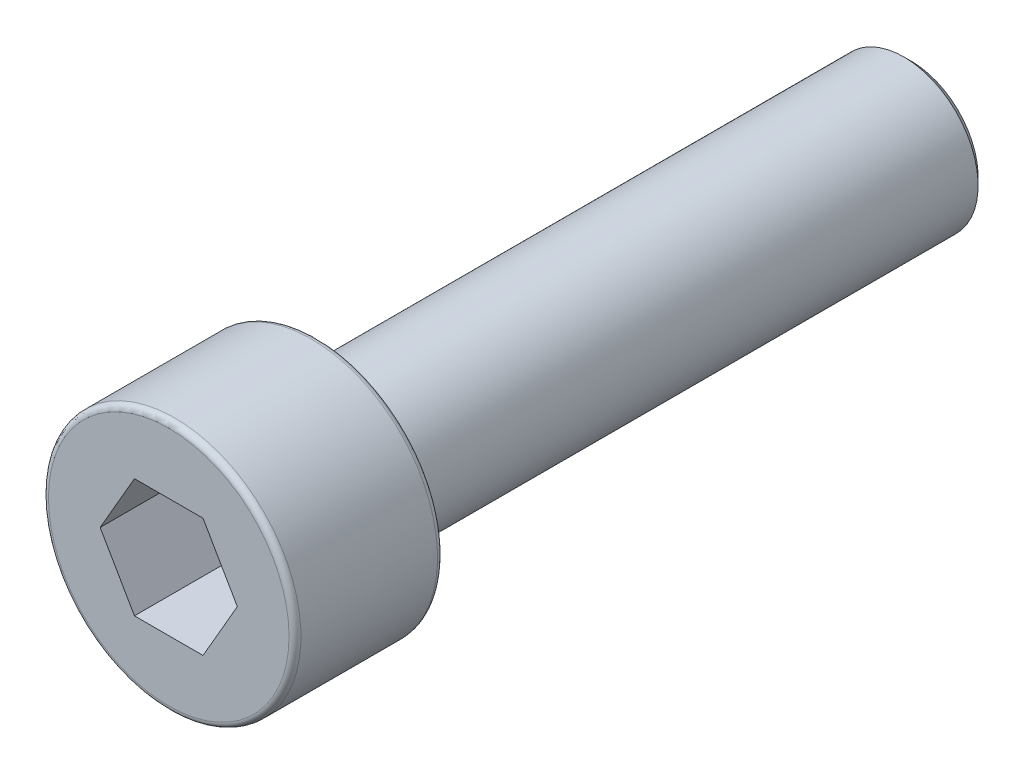
ISO-10303-21;
HEADER;
FILE_DESCRIPTION(('STEP AP214'),'2;1');
FILE_NAME('part.step','',(''),(''),'','','');
FILE_SCHEMA(('AUTOMOTIVE_DESIGN { 1 0 10303 214 1 1 1 1 }'));
ENDSEC;
DATA;
#1=APPLICATION_CONTEXT('core data for automotive mechanical design processes');
#2=APPLICATION_PROTOCOL_DEFINITION('international standard','automotive_design',2000,#1);
#3=PRODUCT_CONTEXT('',#1,'mechanical');
#4=PRODUCT('Part','Part','',(#3));
#5=PRODUCT_RELATED_PRODUCT_CATEGORY('part','',(#4));
#6=PRODUCT_DEFINITION_FORMATION('','',#4);
#7=PRODUCT_DEFINITION_CONTEXT('part definition',#1,'design');
#8=PRODUCT_DEFINITION('design','',#6,#7);
#9=PRODUCT_DEFINITION_SHAPE('','',#8);
#10=(LENGTH_UNIT() NAMED_UNIT(*) SI_UNIT(.MILLI.,.METRE.));
#11=(NAMED_UNIT(*) PLANE_ANGLE_UNIT() SI_UNIT($,.RADIAN.));
#12=(NAMED_UNIT(*) SI_UNIT($,.STERADIAN.) SOLID_ANGLE_UNIT());
#13=UNCERTAINTY_MEASURE_WITH_UNIT(LENGTH_MEASURE(1.E-05),#10,'distance_accuracy_value','');
#14=(GEOMETRIC_REPRESENTATION_CONTEXT(3) GLOBAL_UNCERTAINTY_ASSIGNED_CONTEXT((#13)) GLOBAL_UNIT_ASSIGNED_CONTEXT((#10,
#11,#12)) REPRESENTATION_CONTEXT('',''));
#15=CARTESIAN_POINT('',(0.,0.,0.));
#16=DIRECTION('',(0.,0.,1.));
#17=DIRECTION('',(1.,0.,0.));
#18=AXIS2_PLACEMENT_3D('',#15,#16,#17);
#19=CARTESIAN_POINT('',(0.,0.,20.));
#20=DIRECTION('',(0.,0.,-1.));
#21=DIRECTION('',(-1.,0.,0.));
#22=AXIS2_PLACEMENT_3D('',#19,#20,#21);
#23=PLANE('',#22);
#24=CARTESIAN_POINT('',(0.,0.,20.));
#25=DIRECTION('',(0.,0.,-1.));
#26=DIRECTION('',(-1.,0.,0.));
#27=AXIS2_PLACEMENT_3D('',#24,#25,#26);
#28=CIRCLE('',#27,4.05);
#29=CARTESIAN_POINT('',(-4.05,0.,20.));
#30=VERTEX_POINT('',#29);
#31=EDGE_CURVE('E40',#30,#30,#28,.T.);
#32=ORIENTED_EDGE('',*,*,#31,.T.);
#33=EDGE_LOOP('',(#32));
#34=FACE_BOUND('',#33,.T.);
#35=CARTESIAN_POINT('',(0.,0.,20.));
#36=DIRECTION('',(0.,0.,-1.));
#37=DIRECTION('',(-1.,0.,0.));
#38=AXIS2_PLACEMENT_3D('',#35,#36,#37);
#39=CIRCLE('',#38,2.5);
#40=CARTESIAN_POINT('',(-2.5,0.,20.));
#41=VERTEX_POINT('',#40);
#42=EDGE_CURVE('E134',#41,#41,#39,.T.);
#43=ORIENTED_EDGE('',*,*,#42,.F.);
#44=EDGE_LOOP('',(#43));
#45=FACE_BOUND('',#44,.T.);
#46=ADVANCED_FACE('F32',(#34,#45),#23,.T.);
#47=CARTESIAN_POINT('',(0.,0.,20.));
#48=DIRECTION('',(0.,0.,1.));
#49=DIRECTION('',(1.,0.,0.));
#50=AXIS2_PLACEMENT_3D('',#47,#48,#49);
#51=CYLINDRICAL_SURFACE('',#50,4.25);
#52=CARTESIAN_POINT('',(0.,0.,20.2));
#53=DIRECTION('',(0.,0.,-1.));
#54=DIRECTION('',(-1.,0.,0.));
#55=AXIS2_PLACEMENT_3D('',#52,#53,#54);
#56=CIRCLE('',#55,4.25);
#57=CARTESIAN_POINT('',(-4.25,0.,20.2));
#58=VERTEX_POINT('',#57);
#59=EDGE_CURVE('E151',#58,#58,#56,.F.);
#60=ORIENTED_EDGE('',*,*,#59,.T.);
#61=EDGE_LOOP('',(#60));
#62=FACE_BOUND('',#61,.T.);
#63=CARTESIAN_POINT('',(0.,0.,24.8));
#64=DIRECTION('',(0.,0.,-1.));
#65=DIRECTION('',(-1.,0.,0.));
#66=AXIS2_PLACEMENT_3D('',#63,#64,#65);
#67=CIRCLE('',#66,4.25);
#68=CARTESIAN_POINT('',(-4.25,0.,24.8));
#69=VERTEX_POINT('',#68);
#70=EDGE_CURVE('E148',#69,#69,#67,.T.);
#71=ORIENTED_EDGE('',*,*,#70,.T.);
#72=EDGE_LOOP('',(#71));
#73=FACE_BOUND('',#72,.T.);
#74=ADVANCED_FACE('F164',(#62,#73),#51,.T.);
#75=CARTESIAN_POINT('',(0.,0.,25.));
#76=DIRECTION('',(0.,0.,-1.));
#77=DIRECTION('',(-1.,0.,0.));
#78=AXIS2_PLACEMENT_3D('',#75,#76,#77);
#79=PLANE('',#78);
#80=CARTESIAN_POINT('',(0.,0.,25.));
#81=DIRECTION('',(0.,0.,-1.));
#82=DIRECTION('',(-1.,0.,0.));
#83=AXIS2_PLACEMENT_3D('',#80,#81,#82);
#84=CIRCLE('',#83,4.05);
#85=CARTESIAN_POINT('',(-4.05,0.,25.));
#86=VERTEX_POINT('',#85);
#87=EDGE_CURVE('E11',#86,#86,#84,.F.);
#88=ORIENTED_EDGE('',*,*,#87,.T.);
#89=EDGE_LOOP('',(#88));
#90=FACE_BOUND('',#89,.T.);
#91=DIRECTION('',(0.499999999999999,-0.866025403784439,0.));
#92=VECTOR('',#91,1.);
#93=CARTESIAN_POINT('',(-2.3094010767585,0.,25.));
#94=LINE('',#93,#92);
#95=CARTESIAN_POINT('',(-2.3094010767585,0.,25.));
#96=VERTEX_POINT('',#95);
#97=CARTESIAN_POINT('',(-1.15470053837925,-2.,25.));
#98=VERTEX_POINT('',#97);
#99=EDGE_CURVE('E121',#96,#98,#94,.T.);
#100=ORIENTED_EDGE('',*,*,#99,.F.);
#101=DIRECTION('',(-0.499999999999999,-0.866025403784439,0.));
#102=VECTOR('',#101,1.);
#103=CARTESIAN_POINT('',(-1.15470053837925,2.,25.));
#104=LINE('',#103,#102);
#105=CARTESIAN_POINT('',(-1.15470053837925,2.,25.));
#106=VERTEX_POINT('',#105);
#107=EDGE_CURVE('E47',#106,#96,#104,.T.);
#108=ORIENTED_EDGE('',*,*,#107,.F.);
#109=DIRECTION('',(-1.,0.,0.));
#110=VECTOR('',#109,1.);
#111=CARTESIAN_POINT('',(1.15470053837925,2.,25.));
#112=LINE('',#111,#110);
#113=CARTESIAN_POINT('',(1.15470053837925,2.,25.));
#114=VERTEX_POINT('',#113);
#115=EDGE_CURVE('E130',#114,#106,#112,.T.);
#116=ORIENTED_EDGE('',*,*,#115,.F.);
#117=DIRECTION('',(-0.499999999999999,0.866025403784439,0.));
#118=VECTOR('',#117,1.);
#119=CARTESIAN_POINT('',(2.3094010767585,0.,25.));
#120=LINE('',#119,#118);
#121=CARTESIAN_POINT('',(2.3094010767585,0.,25.));
#122=VERTEX_POINT('',#121);
#123=EDGE_CURVE('E128',#122,#114,#120,.T.);
#124=ORIENTED_EDGE('',*,*,#123,.F.);
#125=DIRECTION('',(0.499999999999999,0.866025403784439,0.));
#126=VECTOR('',#125,1.);
#127=CARTESIAN_POINT('',(1.15470053837925,-2.,25.));
#128=LINE('',#127,#126);
#129=CARTESIAN_POINT('',(1.15470053837925,-2.,25.));
#130=VERTEX_POINT('',#129);
#131=EDGE_CURVE('E95',#130,#122,#128,.T.);
#132=ORIENTED_EDGE('',*,*,#131,.F.);
#133=DIRECTION('',(1.,0.,0.));
#134=VECTOR('',#133,1.);
#135=CARTESIAN_POINT('',(-1.15470053837925,-2.,25.));
#136=LINE('',#135,#134);
#137=EDGE_CURVE('E124',#98,#130,#136,.T.);
#138=ORIENTED_EDGE('',*,*,#137,.F.);
#139=EDGE_LOOP('',(#100,#108,#116,#124,#132,#138));
#140=FACE_BOUND('',#139,.T.);
#141=ADVANCED_FACE('F167',(#90,#140),#79,.F.);
#142=CARTESIAN_POINT('',(0.,0.,0.));
#143=DIRECTION('',(0.,0.,1.));
#144=DIRECTION('',(1.,0.,0.));
#145=AXIS2_PLACEMENT_3D('',#142,#143,#144);
#146=CYLINDRICAL_SURFACE('',#145,2.5);
#147=CARTESIAN_POINT('',(0.,0.,0.250000000055027));
#148=DIRECTION('',(0.,0.,-1.));
#149=DIRECTION('',(-1.,0.,0.));
#150=AXIS2_PLACEMENT_3D('',#147,#148,#149);
#151=CIRCLE('',#150,2.5);
#152=CARTESIAN_POINT('',(-2.5,0.,0.250000000055027));
#153=VERTEX_POINT('',#152);
#154=EDGE_CURVE('E145',#153,#153,#151,.F.);
#155=ORIENTED_EDGE('',*,*,#154,.T.);
#156=EDGE_LOOP('',(#155));
#157=FACE_BOUND('',#156,.T.);
#158=ORIENTED_EDGE('',*,*,#42,.T.);
#159=EDGE_LOOP('',(#158));
#160=FACE_BOUND('',#159,.T.);
#161=ADVANCED_FACE('F177',(#157,#160),#146,.T.);
#162=CARTESIAN_POINT('',(0.,0.,0.));
#163=DIRECTION('',(0.,0.,-1.));
#164=DIRECTION('',(-1.,0.,0.));
#165=AXIS2_PLACEMENT_3D('',#162,#163,#164);
#166=PLANE('',#165);
#167=CARTESIAN_POINT('',(0.,0.,0.));
#168=DIRECTION('',(0.,0.,-1.));
#169=DIRECTION('',(-1.,0.,0.));
#170=AXIS2_PLACEMENT_3D('',#167,#168,#169);
#171=CIRCLE('',#170,2.24999999994498);
#172=CARTESIAN_POINT('',(-2.24999999994498,0.,0.));
#173=VERTEX_POINT('',#172);
#174=EDGE_CURVE('E142',#173,#173,#171,.T.);
#175=ORIENTED_EDGE('',*,*,#174,.T.);
#176=EDGE_LOOP('',(#175));
#177=FACE_BOUND('',#176,.T.);
#178=ADVANCED_FACE('F188',(#177),#166,.T.);
#179=CARTESIAN_POINT('',(-1.15470053837925,2.,21.));
#180=DIRECTION('',(-0.866025403784439,0.499999999999999,0.));
#181=DIRECTION('',(-0.499999999999999,-0.866025403784439,0.));
#182=AXIS2_PLACEMENT_3D('',#179,#180,#181);
#183=PLANE('',#182);
#184=ORIENTED_EDGE('',*,*,#107,.T.);
#185=DIRECTION('',(0.,0.,1.));
#186=VECTOR('',#185,1.);
#187=CARTESIAN_POINT('',(-2.3094010767585,0.,21.));
#188=LINE('',#187,#186);
#189=CARTESIAN_POINT('',(-2.3094010767585,0.,21.));
#190=VERTEX_POINT('',#189);
#191=EDGE_CURVE('E77',#190,#96,#188,.T.);
#192=ORIENTED_EDGE('',*,*,#191,.F.);
#193=DIRECTION('',(-0.499999999999999,-0.866025403784439,0.));
#194=VECTOR('',#193,1.);
#195=CARTESIAN_POINT('',(-1.15470053837925,2.,21.));
#196=LINE('',#195,#194);
#197=CARTESIAN_POINT('',(-1.15470053837925,2.,21.));
#198=VERTEX_POINT('',#197);
#199=EDGE_CURVE('E132',#198,#190,#196,.T.);
#200=ORIENTED_EDGE('',*,*,#199,.F.);
#201=DIRECTION('',(0.,0.,1.));
#202=VECTOR('',#201,1.);
#203=CARTESIAN_POINT('',(-1.15470053837925,2.,21.));
#204=LINE('',#203,#202);
#205=EDGE_CURVE('E55',#198,#106,#204,.T.);
#206=ORIENTED_EDGE('',*,*,#205,.T.);
#207=EDGE_LOOP('',(#184,#192,#200,#206));
#208=FACE_BOUND('',#207,.T.);
#209=ADVANCED_FACE('F185',(#208),#183,.F.);
#210=CARTESIAN_POINT('',(1.15470053837925,2.,21.));
#211=DIRECTION('',(0.,1.,0.));
#212=DIRECTION('',(-1.,0.,0.));
#213=AXIS2_PLACEMENT_3D('',#210,#211,#212);
#214=PLANE('',#213);
#215=ORIENTED_EDGE('',*,*,#115,.T.);
#216=ORIENTED_EDGE('',*,*,#205,.F.);
#217=DIRECTION('',(-1.,0.,0.));
#218=VECTOR('',#217,1.);
#219=CARTESIAN_POINT('',(1.15470053837925,2.,21.));
#220=LINE('',#219,#218);
#221=CARTESIAN_POINT('',(1.15470053837925,2.,21.));
#222=VERTEX_POINT('',#221);
#223=EDGE_CURVE('E107',#222,#198,#220,.T.);
#224=ORIENTED_EDGE('',*,*,#223,.F.);
#225=DIRECTION('',(0.,0.,1.));
#226=VECTOR('',#225,1.);
#227=CARTESIAN_POINT('',(1.15470053837925,2.,21.));
#228=LINE('',#227,#226);
#229=EDGE_CURVE('E99',#222,#114,#228,.T.);
#230=ORIENTED_EDGE('',*,*,#229,.T.);
#231=EDGE_LOOP('',(#215,#216,#224,#230));
#232=FACE_BOUND('',#231,.T.);
#233=ADVANCED_FACE('F187',(#232),#214,.F.);
#234=CARTESIAN_POINT('',(2.3094010767585,0.,21.));
#235=DIRECTION('',(0.866025403784439,0.499999999999999,0.));
#236=DIRECTION('',(-0.499999999999999,0.866025403784439,0.));
#237=AXIS2_PLACEMENT_3D('',#234,#235,#236);
#238=PLANE('',#237);
#239=ORIENTED_EDGE('',*,*,#123,.T.);
#240=ORIENTED_EDGE('',*,*,#229,.F.);
#241=DIRECTION('',(-0.499999999999999,0.866025403784439,0.));
#242=VECTOR('',#241,1.);
#243=CARTESIAN_POINT('',(2.3094010767585,0.,21.));
#244=LINE('',#243,#242);
#245=CARTESIAN_POINT('',(2.3094010767585,0.,21.));
#246=VERTEX_POINT('',#245);
#247=EDGE_CURVE('E103',#246,#222,#244,.T.);
#248=ORIENTED_EDGE('',*,*,#247,.F.);
#249=DIRECTION('',(0.,0.,1.));
#250=VECTOR('',#249,1.);
#251=CARTESIAN_POINT('',(2.3094010767585,0.,21.));
#252=LINE('',#251,#250);
#253=EDGE_CURVE('E88',#246,#122,#252,.T.);
#254=ORIENTED_EDGE('',*,*,#253,.T.);
#255=EDGE_LOOP('',(#239,#240,#248,#254));
#256=FACE_BOUND('',#255,.T.);
#257=ADVANCED_FACE('F104',(#256),#238,.F.);
#258=CARTESIAN_POINT('',(1.15470053837925,-2.,21.));
#259=DIRECTION('',(0.866025403784439,-0.499999999999999,0.));
#260=DIRECTION('',(0.5,0.866025403784439,0.));
#261=AXIS2_PLACEMENT_3D('',#258,#259,#260);
#262=PLANE('',#261);
#263=ORIENTED_EDGE('',*,*,#131,.T.);
#264=ORIENTED_EDGE('',*,*,#253,.F.);
#265=DIRECTION('',(0.499999999999999,0.866025403784439,0.));
#266=VECTOR('',#265,1.);
#267=CARTESIAN_POINT('',(1.15470053837925,-2.,21.));
#268=LINE('',#267,#266);
#269=CARTESIAN_POINT('',(1.15470053837925,-2.,21.));
#270=VERTEX_POINT('',#269);
#271=EDGE_CURVE('E92',#270,#246,#268,.T.);
#272=ORIENTED_EDGE('',*,*,#271,.F.);
#273=DIRECTION('',(0.,0.,1.));
#274=VECTOR('',#273,1.);
#275=CARTESIAN_POINT('',(1.15470053837925,-2.,21.));
#276=LINE('',#275,#274);
#277=EDGE_CURVE('E100',#270,#130,#276,.T.);
#278=ORIENTED_EDGE('',*,*,#277,.T.);
#279=EDGE_LOOP('',(#263,#264,#272,#278));
#280=FACE_BOUND('',#279,.T.);
#281=ADVANCED_FACE('F90',(#280),#262,.F.);
#282=CARTESIAN_POINT('',(-1.15470053837925,-2.,21.));
#283=DIRECTION('',(0.,-1.,0.));
#284=DIRECTION('',(1.,0.,0.));
#285=AXIS2_PLACEMENT_3D('',#282,#283,#284);
#286=PLANE('',#285);
#287=ORIENTED_EDGE('',*,*,#137,.T.);
#288=ORIENTED_EDGE('',*,*,#277,.F.);
#289=DIRECTION('',(1.,0.,0.));
#290=VECTOR('',#289,1.);
#291=CARTESIAN_POINT('',(-1.15470053837925,-2.,21.));
#292=LINE('',#291,#290);
#293=CARTESIAN_POINT('',(-1.15470053837925,-2.,21.));
#294=VERTEX_POINT('',#293);
#295=EDGE_CURVE('E113',#294,#270,#292,.T.);
#296=ORIENTED_EDGE('',*,*,#295,.F.);
#297=DIRECTION('',(0.,0.,1.));
#298=VECTOR('',#297,1.);
#299=CARTESIAN_POINT('',(-1.15470053837925,-2.,21.));
#300=LINE('',#299,#298);
#301=EDGE_CURVE('E137',#294,#98,#300,.T.);
#302=ORIENTED_EDGE('',*,*,#301,.T.);
#303=EDGE_LOOP('',(#287,#288,#296,#302));
#304=FACE_BOUND('',#303,.T.);
#305=ADVANCED_FACE('F273',(#304),#286,.F.);
#306=CARTESIAN_POINT('',(-2.3094010767585,0.,21.));
#307=DIRECTION('',(-0.866025403784439,-0.499999999999999,0.));
#308=DIRECTION('',(0.499999999999999,-0.866025403784439,0.));
#309=AXIS2_PLACEMENT_3D('',#306,#307,#308);
#310=PLANE('',#309);
#311=ORIENTED_EDGE('',*,*,#99,.T.);
#312=ORIENTED_EDGE('',*,*,#301,.F.);
#313=DIRECTION('',(0.499999999999999,-0.866025403784439,0.));
#314=VECTOR('',#313,1.);
#315=CARTESIAN_POINT('',(-2.3094010767585,0.,21.));
#316=LINE('',#315,#314);
#317=EDGE_CURVE('E115',#190,#294,#316,.T.);
#318=ORIENTED_EDGE('',*,*,#317,.F.);
#319=ORIENTED_EDGE('',*,*,#191,.T.);
#320=EDGE_LOOP('',(#311,#312,#318,#319));
#321=FACE_BOUND('',#320,.T.);
#322=ADVANCED_FACE('F183',(#321),#310,.F.);
#323=CARTESIAN_POINT('',(0.,0.,21.));
#324=DIRECTION('',(0.,0.,1.));
#325=DIRECTION('',(1.,0.,0.));
#326=AXIS2_PLACEMENT_3D('',#323,#324,#325);
#327=PLANE('',#326);
#328=ORIENTED_EDGE('',*,*,#199,.T.);
#329=ORIENTED_EDGE('',*,*,#317,.T.);
#330=ORIENTED_EDGE('',*,*,#295,.T.);
#331=ORIENTED_EDGE('',*,*,#271,.T.);
#332=ORIENTED_EDGE('',*,*,#247,.T.);
#333=ORIENTED_EDGE('',*,*,#223,.T.);
#334=EDGE_LOOP('',(#328,#329,#330,#331,#332,#333));
#335=FACE_BOUND('',#334,.T.);
#336=ADVANCED_FACE('F110',(#335),#327,.T.);
#337=CARTESIAN_POINT('',(0.,0.,0.));
#338=DIRECTION('',(0.,0.,1.));
#339=DIRECTION('',(1.,0.,0.));
#340=AXIS2_PLACEMENT_3D('',#337,#338,#339);
#341=CONICAL_SURFACE('',#340,2.24999999994498,0.785398163397442);
#342=ORIENTED_EDGE('',*,*,#154,.F.);
#343=EDGE_LOOP('',(#342));
#344=FACE_BOUND('',#343,.T.);
#345=ORIENTED_EDGE('',*,*,#174,.F.);
#346=EDGE_LOOP('',(#345));
#347=FACE_BOUND('',#346,.T.);
#348=ADVANCED_FACE('F161',(#344,#347),#341,.T.);
#349=CARTESIAN_POINT('',(0.,0.,20.2));
#350=DIRECTION('',(0.,0.,-1.));
#351=DIRECTION('',(-1.,0.,0.));
#352=AXIS2_PLACEMENT_3D('',#349,#350,#351);
#353=TOROIDAL_SURFACE('',#352,4.05,0.200000000000001);
#354=ORIENTED_EDGE('',*,*,#31,.F.);
#355=EDGE_LOOP('',(#354));
#356=FACE_BOUND('',#355,.T.);
#357=ORIENTED_EDGE('',*,*,#59,.F.);
#358=EDGE_LOOP('',(#357));
#359=FACE_BOUND('',#358,.T.);
#360=ADVANCED_FACE('F158',(#356,#359),#353,.T.);
#361=CARTESIAN_POINT('',(0.,0.,24.8));
#362=DIRECTION('',(0.,0.,-1.));
#363=DIRECTION('',(-1.,0.,0.));
#364=AXIS2_PLACEMENT_3D('',#361,#362,#363);
#365=TOROIDAL_SURFACE('',#364,4.05,0.200000000000001);
#366=ORIENTED_EDGE('',*,*,#70,.F.);
#367=EDGE_LOOP('',(#366));
#368=FACE_BOUND('',#367,.T.);
#369=ORIENTED_EDGE('',*,*,#87,.F.);
#370=EDGE_LOOP('',(#369));
#371=FACE_BOUND('',#370,.T.);
#372=ADVANCED_FACE('F34',(#368,#371),#365,.T.);
#373=CLOSED_SHELL('',(#46,#74,#141,#161,#178,#209,#233,#257,#281,#305,#322,#336,#348,#360,#372));
#374=MANIFOLD_SOLID_BREP('B2',#373);
#375=ADVANCED_BREP_SHAPE_REPRESENTATION('',(#18,#374),#14);
#376=SHAPE_DEFINITION_REPRESENTATION(#9,#375);
ENDSEC;
END-ISO-10303-21;
